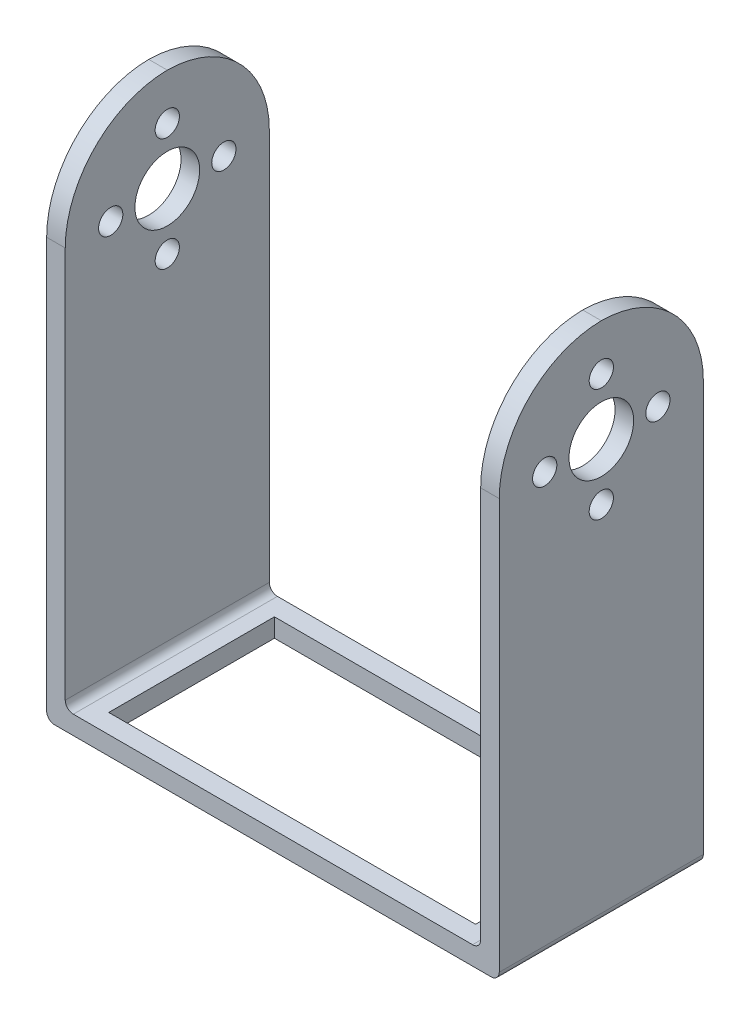
ISO-10303-21;
HEADER;
FILE_DESCRIPTION(('STEP AP214'),'2;1');
FILE_NAME('part.step','',(''),(''),'','','');
FILE_SCHEMA(('AUTOMOTIVE_DESIGN { 1 0 10303 214 1 1 1 1 }'));
ENDSEC;
DATA;
#1=APPLICATION_CONTEXT('core data for automotive mechanical design processes');
#2=APPLICATION_PROTOCOL_DEFINITION('international standard','automotive_design',2000,#1);
#3=PRODUCT_CONTEXT('',#1,'mechanical');
#4=PRODUCT('Part','Part','',(#3));
#5=PRODUCT_RELATED_PRODUCT_CATEGORY('part','',(#4));
#6=PRODUCT_DEFINITION_FORMATION('','',#4);
#7=PRODUCT_DEFINITION_CONTEXT('part definition',#1,'design');
#8=PRODUCT_DEFINITION('design','',#6,#7);
#9=PRODUCT_DEFINITION_SHAPE('','',#8);
#10=(LENGTH_UNIT() NAMED_UNIT(*) SI_UNIT(.MILLI.,.METRE.));
#11=(NAMED_UNIT(*) PLANE_ANGLE_UNIT() SI_UNIT($,.RADIAN.));
#12=(NAMED_UNIT(*) SI_UNIT($,.STERADIAN.) SOLID_ANGLE_UNIT());
#13=UNCERTAINTY_MEASURE_WITH_UNIT(LENGTH_MEASURE(1.E-05),#10,'distance_accuracy_value','');
#14=(GEOMETRIC_REPRESENTATION_CONTEXT(3) GLOBAL_UNCERTAINTY_ASSIGNED_CONTEXT((#13)) GLOBAL_UNIT_ASSIGNED_CONTEXT((#10,
#11,#12)) REPRESENTATION_CONTEXT('',''));
#15=CARTESIAN_POINT('',(0.,0.,0.));
#16=DIRECTION('',(0.,0.,1.));
#17=DIRECTION('',(1.,0.,0.));
#18=AXIS2_PLACEMENT_3D('',#15,#16,#17);
#19=CARTESIAN_POINT('',(28.,32.25,25.25));
#20=DIRECTION('',(-1.,0.,0.));
#21=DIRECTION('',(0.,-1.,0.));
#22=AXIS2_PLACEMENT_3D('',#19,#20,#21);
#23=PLANE('',#22);
#24=CARTESIAN_POINT('',(28.,26.5493872401775,12.625));
#25=DIRECTION('',(-1.,0.,0.));
#26=DIRECTION('',(0.,-1.,0.));
#27=AXIS2_PLACEMENT_3D('',#24,#25,#26);
#28=CIRCLE('',#27,1.5);
#29=CARTESIAN_POINT('',(28.,25.0493872401775,12.625));
#30=VERTEX_POINT('',#29);
#31=EDGE_CURVE('E678',#30,#30,#28,.T.);
#32=ORIENTED_EDGE('',*,*,#31,.T.);
#33=EDGE_LOOP('',(#32));
#34=FACE_BOUND('',#33,.T.);
#35=CARTESIAN_POINT('',(28.,19.5493872401775,19.625));
#36=DIRECTION('',(-1.,0.,0.));
#37=DIRECTION('',(0.,-1.,0.));
#38=AXIS2_PLACEMENT_3D('',#35,#36,#37);
#39=CIRCLE('',#38,1.5);
#40=CARTESIAN_POINT('',(28.,18.0493872401775,19.625));
#41=VERTEX_POINT('',#40);
#42=EDGE_CURVE('E671',#41,#41,#39,.T.);
#43=ORIENTED_EDGE('',*,*,#42,.T.);
#44=EDGE_LOOP('',(#43));
#45=FACE_BOUND('',#44,.T.);
#46=CARTESIAN_POINT('',(28.,12.5493872401775,12.625));
#47=DIRECTION('',(-1.,0.,0.));
#48=DIRECTION('',(0.,-1.,0.));
#49=AXIS2_PLACEMENT_3D('',#46,#47,#48);
#50=CIRCLE('',#49,1.5);
#51=CARTESIAN_POINT('',(28.,11.0493872401775,12.625));
#52=VERTEX_POINT('',#51);
#53=EDGE_CURVE('E692',#52,#52,#50,.T.);
#54=ORIENTED_EDGE('',*,*,#53,.T.);
#55=EDGE_LOOP('',(#54));
#56=FACE_BOUND('',#55,.T.);
#57=CARTESIAN_POINT('',(28.,19.5493872401775,5.625));
#58=DIRECTION('',(-1.,0.,0.));
#59=DIRECTION('',(0.,-1.,0.));
#60=AXIS2_PLACEMENT_3D('',#57,#58,#59);
#61=CIRCLE('',#60,1.5);
#62=CARTESIAN_POINT('',(28.,18.0493872401775,5.625));
#63=VERTEX_POINT('',#62);
#64=EDGE_CURVE('E684',#63,#63,#61,.T.);
#65=ORIENTED_EDGE('',*,*,#64,.T.);
#66=EDGE_LOOP('',(#65));
#67=FACE_BOUND('',#66,.T.);
#68=CARTESIAN_POINT('',(28.,19.5493872401775,12.625));
#69=DIRECTION('',(-1.,0.,0.));
#70=DIRECTION('',(0.,-1.,0.));
#71=AXIS2_PLACEMENT_3D('',#68,#69,#70);
#72=CIRCLE('',#71,4.);
#73=CARTESIAN_POINT('',(28.,15.5493872401775,12.625));
#74=VERTEX_POINT('',#73);
#75=EDGE_CURVE('E367',#74,#74,#72,.T.);
#76=ORIENTED_EDGE('',*,*,#75,.T.);
#77=EDGE_LOOP('',(#76));
#78=FACE_BOUND('',#77,.T.);
#79=CARTESIAN_POINT('',(28.,19.5,12.75));
#80=DIRECTION('',(-1.,0.,0.));
#81=DIRECTION('',(0.,-1.,0.));
#82=AXIS2_PLACEMENT_3D('',#79,#80,#81);
#83=CIRCLE('',#82,12.75);
#84=CARTESIAN_POINT('',(28.,19.5,0.));
#85=VERTEX_POINT('',#84);
#86=CARTESIAN_POINT('',(28.,32.2493872401775,12.625));
#87=VERTEX_POINT('',#86);
#88=EDGE_CURVE('E336',#85,#87,#83,.F.);
#89=ORIENTED_EDGE('',*,*,#88,.T.);
#90=CARTESIAN_POINT('',(28.,19.5,12.5));
#91=DIRECTION('',(-1.,0.,0.));
#92=DIRECTION('',(0.,-1.,0.));
#93=AXIS2_PLACEMENT_3D('',#90,#91,#92);
#94=CIRCLE('',#93,12.75);
#95=CARTESIAN_POINT('',(28.,19.5,25.25));
#96=VERTEX_POINT('',#95);
#97=EDGE_CURVE('E339',#87,#96,#94,.F.);
#98=ORIENTED_EDGE('',*,*,#97,.T.);
#99=DIRECTION('',(0.,1.,0.));
#100=VECTOR('',#99,1.);
#101=CARTESIAN_POINT('',(28.,32.25,25.25));
#102=LINE('',#101,#100);
#103=CARTESIAN_POINT('',(28.,-31.25,25.25));
#104=VERTEX_POINT('',#103);
#105=EDGE_CURVE('E233',#104,#96,#102,.T.);
#106=ORIENTED_EDGE('',*,*,#105,.F.);
#107=DIRECTION('',(0.,0.,-1.));
#108=VECTOR('',#107,1.);
#109=CARTESIAN_POINT('',(28.,-31.25,25.25));
#110=LINE('',#109,#108);
#111=CARTESIAN_POINT('',(28.,-31.25,0.));
#112=VERTEX_POINT('',#111);
#113=EDGE_CURVE('E278',#104,#112,#110,.T.);
#114=ORIENTED_EDGE('',*,*,#113,.T.);
#115=DIRECTION('',(0.,1.,0.));
#116=VECTOR('',#115,1.);
#117=CARTESIAN_POINT('',(28.,32.25,0.));
#118=LINE('',#117,#116);
#119=EDGE_CURVE('E221',#112,#85,#118,.T.);
#120=ORIENTED_EDGE('',*,*,#119,.T.);
#121=EDGE_LOOP('',(#89,#98,#106,#114,#120));
#122=FACE_BOUND('',#121,.T.);
#123=ADVANCED_FACE('F45',(#34,#45,#56,#67,#78,#122),#23,.F.);
#124=CARTESIAN_POINT('',(-28.,32.25,25.25));
#125=DIRECTION('',(1.,0.,0.));
#126=DIRECTION('',(0.,1.,0.));
#127=AXIS2_PLACEMENT_3D('',#124,#125,#126);
#128=PLANE('',#127);
#129=CARTESIAN_POINT('',(-28.,26.5493872401775,12.625));
#130=DIRECTION('',(-1.,0.,0.));
#131=DIRECTION('',(0.,-1.,0.));
#132=AXIS2_PLACEMENT_3D('',#129,#130,#131);
#133=CIRCLE('',#132,1.5);
#134=CARTESIAN_POINT('',(-28.,25.0493872401775,12.625));
#135=VERTEX_POINT('',#134);
#136=EDGE_CURVE('E667',#135,#135,#133,.T.);
#137=ORIENTED_EDGE('',*,*,#136,.F.);
#138=EDGE_LOOP('',(#137));
#139=FACE_BOUND('',#138,.T.);
#140=CARTESIAN_POINT('',(-28.,19.5493872401775,19.625));
#141=DIRECTION('',(-1.,0.,0.));
#142=DIRECTION('',(0.,-1.,0.));
#143=AXIS2_PLACEMENT_3D('',#140,#141,#142);
#144=CIRCLE('',#143,1.5);
#145=CARTESIAN_POINT('',(-28.,18.0493872401775,19.625));
#146=VERTEX_POINT('',#145);
#147=EDGE_CURVE('E652',#146,#146,#144,.T.);
#148=ORIENTED_EDGE('',*,*,#147,.F.);
#149=EDGE_LOOP('',(#148));
#150=FACE_BOUND('',#149,.T.);
#151=CARTESIAN_POINT('',(-28.,12.5493872401775,12.625));
#152=DIRECTION('',(-1.,0.,0.));
#153=DIRECTION('',(0.,-1.,0.));
#154=AXIS2_PLACEMENT_3D('',#151,#152,#153);
#155=CIRCLE('',#154,1.5);
#156=CARTESIAN_POINT('',(-28.,11.0493872401775,12.625));
#157=VERTEX_POINT('',#156);
#158=EDGE_CURVE('E675',#157,#157,#155,.T.);
#159=ORIENTED_EDGE('',*,*,#158,.F.);
#160=EDGE_LOOP('',(#159));
#161=FACE_BOUND('',#160,.T.);
#162=CARTESIAN_POINT('',(-28.,19.5493872401775,5.625));
#163=DIRECTION('',(-1.,0.,0.));
#164=DIRECTION('',(0.,-1.,0.));
#165=AXIS2_PLACEMENT_3D('',#162,#163,#164);
#166=CIRCLE('',#165,1.5);
#167=CARTESIAN_POINT('',(-28.,18.0493872401775,5.625));
#168=VERTEX_POINT('',#167);
#169=EDGE_CURVE('E688',#168,#168,#166,.T.);
#170=ORIENTED_EDGE('',*,*,#169,.F.);
#171=EDGE_LOOP('',(#170));
#172=FACE_BOUND('',#171,.T.);
#173=CARTESIAN_POINT('',(-28.,19.5493872401775,12.625));
#174=DIRECTION('',(-1.,0.,0.));
#175=DIRECTION('',(0.,-1.,0.));
#176=AXIS2_PLACEMENT_3D('',#173,#174,#175);
#177=CIRCLE('',#176,4.);
#178=CARTESIAN_POINT('',(-28.,15.5493872401775,12.625));
#179=VERTEX_POINT('',#178);
#180=EDGE_CURVE('E663',#179,#179,#177,.T.);
#181=ORIENTED_EDGE('',*,*,#180,.F.);
#182=EDGE_LOOP('',(#181));
#183=FACE_BOUND('',#182,.T.);
#184=DIRECTION('',(0.,-1.,0.));
#185=VECTOR('',#184,1.);
#186=CARTESIAN_POINT('',(-28.,32.25,25.25));
#187=LINE('',#186,#185);
#188=CARTESIAN_POINT('',(-28.,19.5,25.25));
#189=VERTEX_POINT('',#188);
#190=CARTESIAN_POINT('',(-28.,-31.25,25.25));
#191=VERTEX_POINT('',#190);
#192=EDGE_CURVE('E237',#189,#191,#187,.T.);
#193=ORIENTED_EDGE('',*,*,#192,.F.);
#194=CARTESIAN_POINT('',(-28.,19.5,12.5));
#195=DIRECTION('',(1.,0.,0.));
#196=DIRECTION('',(0.,1.,0.));
#197=AXIS2_PLACEMENT_3D('',#194,#195,#196);
#198=CIRCLE('',#197,12.75);
#199=CARTESIAN_POINT('',(-28.,32.2493872401775,12.625));
#200=VERTEX_POINT('',#199);
#201=EDGE_CURVE('E321',#189,#200,#198,.F.);
#202=ORIENTED_EDGE('',*,*,#201,.T.);
#203=CARTESIAN_POINT('',(-28.,19.5,12.75));
#204=DIRECTION('',(1.,0.,0.));
#205=DIRECTION('',(0.,1.,0.));
#206=AXIS2_PLACEMENT_3D('',#203,#204,#205);
#207=CIRCLE('',#206,12.75);
#208=CARTESIAN_POINT('',(-28.,19.5,0.));
#209=VERTEX_POINT('',#208);
#210=EDGE_CURVE('E318',#200,#209,#207,.F.);
#211=ORIENTED_EDGE('',*,*,#210,.T.);
#212=DIRECTION('',(0.,-1.,0.));
#213=VECTOR('',#212,1.);
#214=CARTESIAN_POINT('',(-28.,32.25,0.));
#215=LINE('',#214,#213);
#216=CARTESIAN_POINT('',(-28.,-31.25,0.));
#217=VERTEX_POINT('',#216);
#218=EDGE_CURVE('E249',#209,#217,#215,.T.);
#219=ORIENTED_EDGE('',*,*,#218,.T.);
#220=DIRECTION('',(0.,0.,-1.));
#221=VECTOR('',#220,1.);
#222=CARTESIAN_POINT('',(-28.,-31.25,25.25));
#223=LINE('',#222,#221);
#224=EDGE_CURVE('E268',#217,#191,#223,.F.);
#225=ORIENTED_EDGE('',*,*,#224,.T.);
#226=EDGE_LOOP('',(#193,#202,#211,#219,#225));
#227=FACE_BOUND('',#226,.T.);
#228=ADVANCED_FACE('F428',(#139,#150,#161,#172,#183,#227),#128,.F.);
#229=CARTESIAN_POINT('',(-28.,-32.25,25.25));
#230=DIRECTION('',(0.,1.,0.));
#231=DIRECTION('',(0.,0.,1.));
#232=AXIS2_PLACEMENT_3D('',#229,#230,#231);
#233=PLANE('',#232);
#234=DIRECTION('',(-1.,0.,0.));
#235=VECTOR('',#234,1.);
#236=CARTESIAN_POINT('',(-22.6934881901596,-32.25,22.875));
#237=LINE('',#236,#235);
#238=CARTESIAN_POINT('',(22.6934881901596,-32.25,22.875));
#239=VERTEX_POINT('',#238);
#240=CARTESIAN_POINT('',(-22.6934881901596,-32.25,22.875));
#241=VERTEX_POINT('',#240);
#242=EDGE_CURVE('E186',#239,#241,#237,.T.);
#243=ORIENTED_EDGE('',*,*,#242,.F.);
#244=DIRECTION('',(0.,0.,1.));
#245=VECTOR('',#244,1.);
#246=CARTESIAN_POINT('',(22.6934881901596,-32.25,22.875));
#247=LINE('',#246,#245);
#248=CARTESIAN_POINT('',(22.6934881901596,-32.25,2.375));
#249=VERTEX_POINT('',#248);
#250=EDGE_CURVE('E63',#249,#239,#247,.T.);
#251=ORIENTED_EDGE('',*,*,#250,.F.);
#252=DIRECTION('',(1.,0.,0.));
#253=VECTOR('',#252,1.);
#254=CARTESIAN_POINT('',(-22.6934881901596,-32.25,2.375));
#255=LINE('',#254,#253);
#256=CARTESIAN_POINT('',(-22.6934881901596,-32.25,2.375));
#257=VERTEX_POINT('',#256);
#258=EDGE_CURVE('E194',#257,#249,#255,.T.);
#259=ORIENTED_EDGE('',*,*,#258,.F.);
#260=DIRECTION('',(0.,0.,-1.));
#261=VECTOR('',#260,1.);
#262=CARTESIAN_POINT('',(-22.6934881901596,-32.25,22.875));
#263=LINE('',#262,#261);
#264=EDGE_CURVE('E176',#241,#257,#263,.T.);
#265=ORIENTED_EDGE('',*,*,#264,.F.);
#266=EDGE_LOOP('',(#243,#251,#259,#265));
#267=FACE_BOUND('',#266,.T.);
#268=DIRECTION('',(1.,0.,0.));
#269=VECTOR('',#268,1.);
#270=CARTESIAN_POINT('',(-28.,-32.25,25.25));
#271=LINE('',#270,#269);
#272=CARTESIAN_POINT('',(-27.,-32.25,25.25));
#273=VERTEX_POINT('',#272);
#274=CARTESIAN_POINT('',(27.,-32.25,25.25));
#275=VERTEX_POINT('',#274);
#276=EDGE_CURVE('E241',#273,#275,#271,.T.);
#277=ORIENTED_EDGE('',*,*,#276,.F.);
#278=DIRECTION('',(0.,0.,-1.));
#279=VECTOR('',#278,1.);
#280=CARTESIAN_POINT('',(-27.,-32.25,25.25));
#281=LINE('',#280,#279);
#282=CARTESIAN_POINT('',(-27.,-32.25,0.));
#283=VERTEX_POINT('',#282);
#284=EDGE_CURVE('E257',#273,#283,#281,.T.);
#285=ORIENTED_EDGE('',*,*,#284,.T.);
#286=DIRECTION('',(1.,0.,0.));
#287=VECTOR('',#286,1.);
#288=CARTESIAN_POINT('',(-28.,-32.25,0.));
#289=LINE('',#288,#287);
#290=CARTESIAN_POINT('',(27.,-32.25,0.));
#291=VERTEX_POINT('',#290);
#292=EDGE_CURVE('E238',#283,#291,#289,.T.);
#293=ORIENTED_EDGE('',*,*,#292,.T.);
#294=DIRECTION('',(0.,0.,-1.));
#295=VECTOR('',#294,1.);
#296=CARTESIAN_POINT('',(27.,-32.25,25.25));
#297=LINE('',#296,#295);
#298=EDGE_CURVE('E245',#291,#275,#297,.F.);
#299=ORIENTED_EDGE('',*,*,#298,.T.);
#300=EDGE_LOOP('',(#277,#285,#293,#299));
#301=FACE_BOUND('',#300,.T.);
#302=ADVANCED_FACE('F191',(#267,#301),#233,.F.);
#303=CARTESIAN_POINT('',(0.,0.,25.25));
#304=DIRECTION('',(0.,0.,1.));
#305=DIRECTION('',(1.,0.,0.));
#306=AXIS2_PLACEMENT_3D('',#303,#304,#305);
#307=PLANE('',#306);
#308=DIRECTION('',(0.,-1.,0.));
#309=VECTOR('',#308,1.);
#310=CARTESIAN_POINT('',(-25.7,32.25,25.25));
#311=LINE('',#310,#309);
#312=CARTESIAN_POINT('',(-25.7,19.5,25.25));
#313=VERTEX_POINT('',#312);
#314=CARTESIAN_POINT('',(-25.7,-28.95,25.25));
#315=VERTEX_POINT('',#314);
#316=EDGE_CURVE('E222',#313,#315,#311,.T.);
#317=ORIENTED_EDGE('',*,*,#316,.F.);
#318=DIRECTION('',(-1.,0.,0.));
#319=VECTOR('',#318,1.);
#320=CARTESIAN_POINT('',(-28.,19.5,25.25));
#321=LINE('',#320,#319);
#322=EDGE_CURVE('E314',#313,#189,#321,.T.);
#323=ORIENTED_EDGE('',*,*,#322,.T.);
#324=ORIENTED_EDGE('',*,*,#192,.T.);
#325=CARTESIAN_POINT('',(-27.,-31.25,25.25));
#326=DIRECTION('',(0.,0.,1.));
#327=DIRECTION('',(1.,0.,0.));
#328=AXIS2_PLACEMENT_3D('',#325,#326,#327);
#329=CIRCLE('',#328,1.);
#330=EDGE_CURVE('E275',#191,#273,#329,.T.);
#331=ORIENTED_EDGE('',*,*,#330,.T.);
#332=ORIENTED_EDGE('',*,*,#276,.T.);
#333=CARTESIAN_POINT('',(27.,-31.25,25.25));
#334=DIRECTION('',(0.,0.,1.));
#335=DIRECTION('',(1.,0.,0.));
#336=AXIS2_PLACEMENT_3D('',#333,#334,#335);
#337=CIRCLE('',#336,1.);
#338=EDGE_CURVE('E272',#275,#104,#337,.T.);
#339=ORIENTED_EDGE('',*,*,#338,.T.);
#340=ORIENTED_EDGE('',*,*,#105,.T.);
#341=DIRECTION('',(-1.,0.,0.));
#342=VECTOR('',#341,1.);
#343=CARTESIAN_POINT('',(25.7,19.5,25.25));
#344=LINE('',#343,#342);
#345=CARTESIAN_POINT('',(25.7,19.5,25.25));
#346=VERTEX_POINT('',#345);
#347=EDGE_CURVE('E310',#96,#346,#344,.T.);
#348=ORIENTED_EDGE('',*,*,#347,.T.);
#349=DIRECTION('',(0.,1.,0.));
#350=VECTOR('',#349,1.);
#351=CARTESIAN_POINT('',(25.7,32.25,25.25));
#352=LINE('',#351,#350);
#353=CARTESIAN_POINT('',(25.7,-28.95,25.25));
#354=VERTEX_POINT('',#353);
#355=EDGE_CURVE('E213',#354,#346,#352,.T.);
#356=ORIENTED_EDGE('',*,*,#355,.F.);
#357=CARTESIAN_POINT('',(24.7,-28.95,25.25));
#358=DIRECTION('',(0.,0.,1.));
#359=DIRECTION('',(1.,0.,0.));
#360=AXIS2_PLACEMENT_3D('',#357,#358,#359);
#361=CIRCLE('',#360,1.);
#362=CARTESIAN_POINT('',(24.7,-29.95,25.25));
#363=VERTEX_POINT('',#362);
#364=EDGE_CURVE('E297',#354,#363,#361,.F.);
#365=ORIENTED_EDGE('',*,*,#364,.T.);
#366=DIRECTION('',(1.,0.,0.));
#367=VECTOR('',#366,1.);
#368=CARTESIAN_POINT('',(-25.7,-29.95,25.25));
#369=LINE('',#368,#367);
#370=CARTESIAN_POINT('',(-24.7,-29.95,25.25));
#371=VERTEX_POINT('',#370);
#372=EDGE_CURVE('E225',#371,#363,#369,.T.);
#373=ORIENTED_EDGE('',*,*,#372,.F.);
#374=CARTESIAN_POINT('',(-24.7,-28.95,25.25));
#375=DIRECTION('',(0.,0.,1.));
#376=DIRECTION('',(1.,0.,0.));
#377=AXIS2_PLACEMENT_3D('',#374,#375,#376);
#378=CIRCLE('',#377,1.);
#379=EDGE_CURVE('E303',#371,#315,#378,.F.);
#380=ORIENTED_EDGE('',*,*,#379,.T.);
#381=EDGE_LOOP('',(#317,#323,#324,#331,#332,#339,#340,#348,#356,#365,#373,#380));
#382=FACE_BOUND('',#381,.T.);
#383=ADVANCED_FACE('F486',(#382),#307,.T.);
#384=CARTESIAN_POINT('',(0.,0.,0.));
#385=DIRECTION('',(0.,0.,1.));
#386=DIRECTION('',(1.,0.,0.));
#387=AXIS2_PLACEMENT_3D('',#384,#385,#386);
#388=PLANE('',#387);
#389=ORIENTED_EDGE('',*,*,#218,.F.);
#390=DIRECTION('',(-1.,0.,0.));
#391=VECTOR('',#390,1.);
#392=CARTESIAN_POINT('',(0.,19.5,0.));
#393=LINE('',#392,#391);
#394=CARTESIAN_POINT('',(-25.7,19.5,0.));
#395=VERTEX_POINT('',#394);
#396=EDGE_CURVE('E345',#209,#395,#393,.F.);
#397=ORIENTED_EDGE('',*,*,#396,.T.);
#398=DIRECTION('',(0.,-1.,0.));
#399=VECTOR('',#398,1.);
#400=CARTESIAN_POINT('',(-25.7,32.25,0.));
#401=LINE('',#400,#399);
#402=CARTESIAN_POINT('',(-25.7,-28.95,0.));
#403=VERTEX_POINT('',#402);
#404=EDGE_CURVE('E209',#395,#403,#401,.T.);
#405=ORIENTED_EDGE('',*,*,#404,.T.);
#406=CARTESIAN_POINT('',(-24.7,-28.95,0.));
#407=DIRECTION('',(0.,0.,1.));
#408=DIRECTION('',(1.,0.,0.));
#409=AXIS2_PLACEMENT_3D('',#406,#407,#408);
#410=CIRCLE('',#409,1.);
#411=CARTESIAN_POINT('',(-24.7,-29.95,0.));
#412=VERTEX_POINT('',#411);
#413=EDGE_CURVE('E307',#403,#412,#410,.T.);
#414=ORIENTED_EDGE('',*,*,#413,.T.);
#415=DIRECTION('',(1.,0.,0.));
#416=VECTOR('',#415,1.);
#417=CARTESIAN_POINT('',(-25.7,-29.95,0.));
#418=LINE('',#417,#416);
#419=CARTESIAN_POINT('',(24.7,-29.95,0.));
#420=VERTEX_POINT('',#419);
#421=EDGE_CURVE('E212',#412,#420,#418,.T.);
#422=ORIENTED_EDGE('',*,*,#421,.T.);
#423=CARTESIAN_POINT('',(24.7,-28.95,0.));
#424=DIRECTION('',(0.,0.,1.));
#425=DIRECTION('',(1.,0.,0.));
#426=AXIS2_PLACEMENT_3D('',#423,#424,#425);
#427=CIRCLE('',#426,1.);
#428=CARTESIAN_POINT('',(25.7,-28.95,0.));
#429=VERTEX_POINT('',#428);
#430=EDGE_CURVE('E300',#420,#429,#427,.T.);
#431=ORIENTED_EDGE('',*,*,#430,.T.);
#432=DIRECTION('',(0.,1.,0.));
#433=VECTOR('',#432,1.);
#434=CARTESIAN_POINT('',(25.7,32.25,0.));
#435=LINE('',#434,#433);
#436=CARTESIAN_POINT('',(25.7,19.5,0.));
#437=VERTEX_POINT('',#436);
#438=EDGE_CURVE('E217',#429,#437,#435,.T.);
#439=ORIENTED_EDGE('',*,*,#438,.T.);
#440=DIRECTION('',(-1.,0.,0.));
#441=VECTOR('',#440,1.);
#442=CARTESIAN_POINT('',(0.,19.5,0.));
#443=LINE('',#442,#441);
#444=EDGE_CURVE('E342',#437,#85,#443,.F.);
#445=ORIENTED_EDGE('',*,*,#444,.T.);
#446=ORIENTED_EDGE('',*,*,#119,.F.);
#447=CARTESIAN_POINT('',(27.,-31.25,0.));
#448=DIRECTION('',(0.,0.,1.));
#449=DIRECTION('',(1.,0.,0.));
#450=AXIS2_PLACEMENT_3D('',#447,#448,#449);
#451=CIRCLE('',#450,1.);
#452=EDGE_CURVE('E261',#112,#291,#451,.F.);
#453=ORIENTED_EDGE('',*,*,#452,.T.);
#454=ORIENTED_EDGE('',*,*,#292,.F.);
#455=CARTESIAN_POINT('',(-27.,-31.25,0.));
#456=DIRECTION('',(0.,0.,1.));
#457=DIRECTION('',(1.,0.,0.));
#458=AXIS2_PLACEMENT_3D('',#455,#456,#457);
#459=CIRCLE('',#458,1.);
#460=EDGE_CURVE('E264',#283,#217,#459,.F.);
#461=ORIENTED_EDGE('',*,*,#460,.T.);
#462=EDGE_LOOP('',(#389,#397,#405,#414,#422,#431,#439,#445,#446,#453,#454,#461));
#463=FACE_BOUND('',#462,.T.);
#464=ADVANCED_FACE('F494',(#463),#388,.F.);
#465=CARTESIAN_POINT('',(-25.7,32.25,0.));
#466=DIRECTION('',(-1.,0.,0.));
#467=DIRECTION('',(0.,-1.,0.));
#468=AXIS2_PLACEMENT_3D('',#465,#466,#467);
#469=PLANE('',#468);
#470=CARTESIAN_POINT('',(-25.7,26.5493872401775,12.625));
#471=DIRECTION('',(-1.,0.,0.));
#472=DIRECTION('',(0.,-1.,0.));
#473=AXIS2_PLACEMENT_3D('',#470,#471,#472);
#474=CIRCLE('',#473,1.5);
#475=CARTESIAN_POINT('',(-25.7,25.0493872401775,12.625));
#476=VERTEX_POINT('',#475);
#477=EDGE_CURVE('E394',#476,#476,#474,.T.);
#478=ORIENTED_EDGE('',*,*,#477,.T.);
#479=EDGE_LOOP('',(#478));
#480=FACE_BOUND('',#479,.T.);
#481=CARTESIAN_POINT('',(-25.7,19.5493872401775,19.625));
#482=DIRECTION('',(-1.,0.,0.));
#483=DIRECTION('',(0.,-1.,0.));
#484=AXIS2_PLACEMENT_3D('',#481,#482,#483);
#485=CIRCLE('',#484,1.5);
#486=CARTESIAN_POINT('',(-25.7,18.0493872401775,19.625));
#487=VERTEX_POINT('',#486);
#488=EDGE_CURVE('E380',#487,#487,#485,.T.);
#489=ORIENTED_EDGE('',*,*,#488,.T.);
#490=EDGE_LOOP('',(#489));
#491=FACE_BOUND('',#490,.T.);
#492=CARTESIAN_POINT('',(-25.7,12.5493872401775,12.625));
#493=DIRECTION('',(-1.,0.,0.));
#494=DIRECTION('',(0.,-1.,0.));
#495=AXIS2_PLACEMENT_3D('',#492,#493,#494);
#496=CIRCLE('',#495,1.5);
#497=CARTESIAN_POINT('',(-25.7,11.0493872401775,12.625));
#498=VERTEX_POINT('',#497);
#499=EDGE_CURVE('E376',#498,#498,#496,.T.);
#500=ORIENTED_EDGE('',*,*,#499,.T.);
#501=EDGE_LOOP('',(#500));
#502=FACE_BOUND('',#501,.T.);
#503=CARTESIAN_POINT('',(-25.7,19.5493872401775,5.625));
#504=DIRECTION('',(-1.,0.,0.));
#505=DIRECTION('',(0.,-1.,0.));
#506=AXIS2_PLACEMENT_3D('',#503,#504,#505);
#507=CIRCLE('',#506,1.5);
#508=CARTESIAN_POINT('',(-25.7,18.0493872401775,5.625));
#509=VERTEX_POINT('',#508);
#510=EDGE_CURVE('E372',#509,#509,#507,.T.);
#511=ORIENTED_EDGE('',*,*,#510,.T.);
#512=EDGE_LOOP('',(#511));
#513=FACE_BOUND('',#512,.T.);
#514=CARTESIAN_POINT('',(-25.7,19.5493872401775,12.625));
#515=DIRECTION('',(-1.,0.,0.));
#516=DIRECTION('',(0.,-1.,0.));
#517=AXIS2_PLACEMENT_3D('',#514,#515,#516);
#518=CIRCLE('',#517,4.);
#519=CARTESIAN_POINT('',(-25.7,15.5493872401775,12.625));
#520=VERTEX_POINT('',#519);
#521=EDGE_CURVE('E366',#520,#520,#518,.T.);
#522=ORIENTED_EDGE('',*,*,#521,.T.);
#523=EDGE_LOOP('',(#522));
#524=FACE_BOUND('',#523,.T.);
#525=CARTESIAN_POINT('',(-25.7,19.5,12.75));
#526=DIRECTION('',(-1.,0.,0.));
#527=DIRECTION('',(0.,-1.,0.));
#528=AXIS2_PLACEMENT_3D('',#525,#526,#527);
#529=CIRCLE('',#528,12.75);
#530=CARTESIAN_POINT('',(-25.7,32.2493872401775,12.625));
#531=VERTEX_POINT('',#530);
#532=EDGE_CURVE('E324',#395,#531,#529,.F.);
#533=ORIENTED_EDGE('',*,*,#532,.T.);
#534=CARTESIAN_POINT('',(-25.7,19.5,12.5));
#535=DIRECTION('',(-1.,0.,0.));
#536=DIRECTION('',(0.,-1.,0.));
#537=AXIS2_PLACEMENT_3D('',#534,#535,#536);
#538=CIRCLE('',#537,12.75);
#539=EDGE_CURVE('E327',#531,#313,#538,.F.);
#540=ORIENTED_EDGE('',*,*,#539,.T.);
#541=ORIENTED_EDGE('',*,*,#316,.T.);
#542=DIRECTION('',(0.,0.,1.));
#543=VECTOR('',#542,1.);
#544=CARTESIAN_POINT('',(-25.7,-28.95,0.));
#545=LINE('',#544,#543);
#546=EDGE_CURVE('E293',#315,#403,#545,.F.);
#547=ORIENTED_EDGE('',*,*,#546,.T.);
#548=ORIENTED_EDGE('',*,*,#404,.F.);
#549=EDGE_LOOP('',(#533,#540,#541,#547,#548));
#550=FACE_BOUND('',#549,.T.);
#551=ADVANCED_FACE('F519',(#480,#491,#502,#513,#524,#550),#469,.F.);
#552=CARTESIAN_POINT('',(25.7,32.25,0.));
#553=DIRECTION('',(1.,0.,0.));
#554=DIRECTION('',(0.,1.,0.));
#555=AXIS2_PLACEMENT_3D('',#552,#553,#554);
#556=PLANE('',#555);
#557=CARTESIAN_POINT('',(25.7,26.5493872401775,12.625));
#558=DIRECTION('',(1.,0.,0.));
#559=DIRECTION('',(0.,1.,0.));
#560=AXIS2_PLACEMENT_3D('',#557,#558,#559);
#561=CIRCLE('',#560,1.5);
#562=CARTESIAN_POINT('',(25.7,28.0493872401775,12.625));
#563=VERTEX_POINT('',#562);
#564=EDGE_CURVE('E49',#563,#563,#561,.T.);
#565=ORIENTED_EDGE('',*,*,#564,.T.);
#566=EDGE_LOOP('',(#565));
#567=FACE_BOUND('',#566,.T.);
#568=CARTESIAN_POINT('',(25.7,19.5493872401775,19.625));
#569=DIRECTION('',(1.,0.,0.));
#570=DIRECTION('',(0.,1.,0.));
#571=AXIS2_PLACEMENT_3D('',#568,#569,#570);
#572=CIRCLE('',#571,1.5);
#573=CARTESIAN_POINT('',(25.7,21.0493872401775,19.625));
#574=VERTEX_POINT('',#573);
#575=EDGE_CURVE('E377',#574,#574,#572,.T.);
#576=ORIENTED_EDGE('',*,*,#575,.T.);
#577=EDGE_LOOP('',(#576));
#578=FACE_BOUND('',#577,.T.);
#579=CARTESIAN_POINT('',(25.7,12.5493872401775,12.625));
#580=DIRECTION('',(1.,0.,0.));
#581=DIRECTION('',(0.,1.,0.));
#582=AXIS2_PLACEMENT_3D('',#579,#580,#581);
#583=CIRCLE('',#582,1.5);
#584=CARTESIAN_POINT('',(25.7,14.0493872401775,12.625));
#585=VERTEX_POINT('',#584);
#586=EDGE_CURVE('E373',#585,#585,#583,.T.);
#587=ORIENTED_EDGE('',*,*,#586,.T.);
#588=EDGE_LOOP('',(#587));
#589=FACE_BOUND('',#588,.T.);
#590=CARTESIAN_POINT('',(25.7,19.5493872401775,5.625));
#591=DIRECTION('',(1.,0.,0.));
#592=DIRECTION('',(0.,1.,0.));
#593=AXIS2_PLACEMENT_3D('',#590,#591,#592);
#594=CIRCLE('',#593,1.5);
#595=CARTESIAN_POINT('',(25.7,21.0493872401775,5.625));
#596=VERTEX_POINT('',#595);
#597=EDGE_CURVE('E368',#596,#596,#594,.T.);
#598=ORIENTED_EDGE('',*,*,#597,.T.);
#599=EDGE_LOOP('',(#598));
#600=FACE_BOUND('',#599,.T.);
#601=CARTESIAN_POINT('',(25.7,19.5493872401775,12.625));
#602=DIRECTION('',(1.,0.,0.));
#603=DIRECTION('',(0.,1.,0.));
#604=AXIS2_PLACEMENT_3D('',#601,#602,#603);
#605=CIRCLE('',#604,4.);
#606=CARTESIAN_POINT('',(25.7,23.5493872401775,12.625));
#607=VERTEX_POINT('',#606);
#608=EDGE_CURVE('E362',#607,#607,#605,.T.);
#609=ORIENTED_EDGE('',*,*,#608,.T.);
#610=EDGE_LOOP('',(#609));
#611=FACE_BOUND('',#610,.T.);
#612=ORIENTED_EDGE('',*,*,#355,.T.);
#613=CARTESIAN_POINT('',(25.7,19.5,12.5));
#614=DIRECTION('',(1.,0.,0.));
#615=DIRECTION('',(0.,1.,0.));
#616=AXIS2_PLACEMENT_3D('',#613,#614,#615);
#617=CIRCLE('',#616,12.75);
#618=CARTESIAN_POINT('',(25.7,32.2493872401775,12.625));
#619=VERTEX_POINT('',#618);
#620=EDGE_CURVE('E333',#346,#619,#617,.F.);
#621=ORIENTED_EDGE('',*,*,#620,.T.);
#622=CARTESIAN_POINT('',(25.7,19.5,12.75));
#623=DIRECTION('',(1.,0.,0.));
#624=DIRECTION('',(0.,1.,0.));
#625=AXIS2_PLACEMENT_3D('',#622,#623,#624);
#626=CIRCLE('',#625,12.75);
#627=EDGE_CURVE('E330',#619,#437,#626,.F.);
#628=ORIENTED_EDGE('',*,*,#627,.T.);
#629=ORIENTED_EDGE('',*,*,#438,.F.);
#630=DIRECTION('',(0.,0.,1.));
#631=VECTOR('',#630,1.);
#632=CARTESIAN_POINT('',(25.7,-28.95,25.25));
#633=LINE('',#632,#631);
#634=EDGE_CURVE('E282',#429,#354,#633,.T.);
#635=ORIENTED_EDGE('',*,*,#634,.T.);
#636=EDGE_LOOP('',(#612,#621,#628,#629,#635));
#637=FACE_BOUND('',#636,.T.);
#638=ADVANCED_FACE('F402',(#567,#578,#589,#600,#611,#637),#556,.F.);
#639=CARTESIAN_POINT('',(-25.7,-29.95,0.));
#640=DIRECTION('',(0.,-1.,0.));
#641=DIRECTION('',(0.,0.,-1.));
#642=AXIS2_PLACEMENT_3D('',#639,#640,#641);
#643=PLANE('',#642);
#644=DIRECTION('',(1.,0.,0.));
#645=VECTOR('',#644,1.);
#646=CARTESIAN_POINT('',(-25.7,-29.95,2.375));
#647=LINE('',#646,#645);
#648=CARTESIAN_POINT('',(-22.6934881901596,-29.95,2.375));
#649=VERTEX_POINT('',#648);
#650=CARTESIAN_POINT('',(22.6934881901596,-29.95,2.375));
#651=VERTEX_POINT('',#650);
#652=EDGE_CURVE('E55',#649,#651,#647,.T.);
#653=ORIENTED_EDGE('',*,*,#652,.T.);
#654=DIRECTION('',(0.,0.,1.));
#655=VECTOR('',#654,1.);
#656=CARTESIAN_POINT('',(22.6934881901596,-29.95,0.));
#657=LINE('',#656,#655);
#658=CARTESIAN_POINT('',(22.6934881901596,-29.95,22.875));
#659=VERTEX_POINT('',#658);
#660=EDGE_CURVE('E11',#651,#659,#657,.T.);
#661=ORIENTED_EDGE('',*,*,#660,.T.);
#662=DIRECTION('',(-1.,0.,0.));
#663=VECTOR('',#662,1.);
#664=CARTESIAN_POINT('',(-25.7,-29.95,22.875));
#665=LINE('',#664,#663);
#666=CARTESIAN_POINT('',(-22.6934881901596,-29.95,22.875));
#667=VERTEX_POINT('',#666);
#668=EDGE_CURVE('E348',#659,#667,#665,.T.);
#669=ORIENTED_EDGE('',*,*,#668,.T.);
#670=DIRECTION('',(0.,0.,-1.));
#671=VECTOR('',#670,1.);
#672=CARTESIAN_POINT('',(-22.6934881901596,-29.95,0.));
#673=LINE('',#672,#671);
#674=EDGE_CURVE('E179',#667,#649,#673,.T.);
#675=ORIENTED_EDGE('',*,*,#674,.T.);
#676=EDGE_LOOP('',(#653,#661,#669,#675));
#677=FACE_BOUND('',#676,.T.);
#678=ORIENTED_EDGE('',*,*,#372,.T.);
#679=DIRECTION('',(0.,0.,1.));
#680=VECTOR('',#679,1.);
#681=CARTESIAN_POINT('',(24.7,-29.95,0.));
#682=LINE('',#681,#680);
#683=EDGE_CURVE('E290',#363,#420,#682,.F.);
#684=ORIENTED_EDGE('',*,*,#683,.T.);
#685=ORIENTED_EDGE('',*,*,#421,.F.);
#686=DIRECTION('',(0.,0.,1.));
#687=VECTOR('',#686,1.);
#688=CARTESIAN_POINT('',(-24.7,-29.95,25.25));
#689=LINE('',#688,#687);
#690=EDGE_CURVE('E286',#412,#371,#689,.T.);
#691=ORIENTED_EDGE('',*,*,#690,.T.);
#692=EDGE_LOOP('',(#678,#684,#685,#691));
#693=FACE_BOUND('',#692,.T.);
#694=ADVANCED_FACE('F445',(#677,#693),#643,.F.);
#695=CARTESIAN_POINT('',(-27.,-31.25,25.25));
#696=DIRECTION('',(0.,0.,-1.));
#697=DIRECTION('',(-1.,0.,0.));
#698=AXIS2_PLACEMENT_3D('',#695,#696,#697);
#699=CYLINDRICAL_SURFACE('',#698,1.);
#700=ORIENTED_EDGE('',*,*,#330,.F.);
#701=ORIENTED_EDGE('',*,*,#224,.F.);
#702=ORIENTED_EDGE('',*,*,#460,.F.);
#703=ORIENTED_EDGE('',*,*,#284,.F.);
#704=EDGE_LOOP('',(#700,#701,#702,#703));
#705=FACE_BOUND('',#704,.T.);
#706=ADVANCED_FACE('F441',(#705),#699,.T.);
#707=CARTESIAN_POINT('',(27.,-31.25,25.25));
#708=DIRECTION('',(0.,0.,-1.));
#709=DIRECTION('',(-1.,0.,0.));
#710=AXIS2_PLACEMENT_3D('',#707,#708,#709);
#711=CYLINDRICAL_SURFACE('',#710,1.);
#712=ORIENTED_EDGE('',*,*,#338,.F.);
#713=ORIENTED_EDGE('',*,*,#298,.F.);
#714=ORIENTED_EDGE('',*,*,#452,.F.);
#715=ORIENTED_EDGE('',*,*,#113,.F.);
#716=EDGE_LOOP('',(#712,#713,#714,#715));
#717=FACE_BOUND('',#716,.T.);
#718=ADVANCED_FACE('F444',(#717),#711,.T.);
#719=CARTESIAN_POINT('',(24.7,-28.95,0.));
#720=DIRECTION('',(0.,0.,-1.));
#721=DIRECTION('',(-1.,0.,0.));
#722=AXIS2_PLACEMENT_3D('',#719,#720,#721);
#723=CYLINDRICAL_SURFACE('',#722,1.);
#724=ORIENTED_EDGE('',*,*,#430,.F.);
#725=ORIENTED_EDGE('',*,*,#683,.F.);
#726=ORIENTED_EDGE('',*,*,#364,.F.);
#727=ORIENTED_EDGE('',*,*,#634,.F.);
#728=EDGE_LOOP('',(#724,#725,#726,#727));
#729=FACE_BOUND('',#728,.T.);
#730=ADVANCED_FACE('F449',(#729),#723,.F.);
#731=CARTESIAN_POINT('',(-24.7,-28.95,0.));
#732=DIRECTION('',(0.,0.,-1.));
#733=DIRECTION('',(-1.,0.,0.));
#734=AXIS2_PLACEMENT_3D('',#731,#732,#733);
#735=CYLINDRICAL_SURFACE('',#734,1.);
#736=ORIENTED_EDGE('',*,*,#413,.F.);
#737=ORIENTED_EDGE('',*,*,#546,.F.);
#738=ORIENTED_EDGE('',*,*,#379,.F.);
#739=ORIENTED_EDGE('',*,*,#690,.F.);
#740=EDGE_LOOP('',(#736,#737,#738,#739));
#741=FACE_BOUND('',#740,.T.);
#742=ADVANCED_FACE('F453',(#741),#735,.F.);
#743=CARTESIAN_POINT('',(-28.,19.5,12.75));
#744=DIRECTION('',(-1.,0.,0.));
#745=DIRECTION('',(0.,0.,1.));
#746=AXIS2_PLACEMENT_3D('',#743,#744,#745);
#747=CYLINDRICAL_SURFACE('',#746,12.75);
#748=DIRECTION('',(-1.,0.,0.));
#749=VECTOR('',#748,1.);
#750=CARTESIAN_POINT('',(-26.85,32.2493872401775,12.625));
#751=LINE('',#750,#749);
#752=EDGE_CURVE('E226',#531,#200,#751,.T.);
#753=ORIENTED_EDGE('',*,*,#752,.F.);
#754=ORIENTED_EDGE('',*,*,#532,.F.);
#755=ORIENTED_EDGE('',*,*,#396,.F.);
#756=ORIENTED_EDGE('',*,*,#210,.F.);
#757=EDGE_LOOP('',(#753,#754,#755,#756));
#758=FACE_BOUND('',#757,.T.);
#759=ADVANCED_FACE('F457',(#758),#747,.T.);
#760=CARTESIAN_POINT('',(0.,19.5,12.5));
#761=DIRECTION('',(1.,0.,0.));
#762=DIRECTION('',(0.,0.,-1.));
#763=AXIS2_PLACEMENT_3D('',#760,#761,#762);
#764=CYLINDRICAL_SURFACE('',#763,12.75);
#765=ORIENTED_EDGE('',*,*,#539,.F.);
#766=ORIENTED_EDGE('',*,*,#752,.T.);
#767=ORIENTED_EDGE('',*,*,#201,.F.);
#768=ORIENTED_EDGE('',*,*,#322,.F.);
#769=EDGE_LOOP('',(#765,#766,#767,#768));
#770=FACE_BOUND('',#769,.T.);
#771=ADVANCED_FACE('F459',(#770),#764,.T.);
#772=CARTESIAN_POINT('',(-28.,19.5,12.75));
#773=DIRECTION('',(-1.,0.,0.));
#774=DIRECTION('',(0.,0.,1.));
#775=AXIS2_PLACEMENT_3D('',#772,#773,#774);
#776=CYLINDRICAL_SURFACE('',#775,12.75);
#777=DIRECTION('',(-1.,0.,0.));
#778=VECTOR('',#777,1.);
#779=CARTESIAN_POINT('',(26.85,32.2493872401775,12.625));
#780=LINE('',#779,#778);
#781=EDGE_CURVE('E204',#87,#619,#780,.T.);
#782=ORIENTED_EDGE('',*,*,#781,.F.);
#783=ORIENTED_EDGE('',*,*,#88,.F.);
#784=ORIENTED_EDGE('',*,*,#444,.F.);
#785=ORIENTED_EDGE('',*,*,#627,.F.);
#786=EDGE_LOOP('',(#782,#783,#784,#785));
#787=FACE_BOUND('',#786,.T.);
#788=ADVANCED_FACE('F47',(#787),#776,.T.);
#789=CARTESIAN_POINT('',(0.,19.5,12.5));
#790=DIRECTION('',(1.,0.,0.));
#791=DIRECTION('',(0.,0.,-1.));
#792=AXIS2_PLACEMENT_3D('',#789,#790,#791);
#793=CYLINDRICAL_SURFACE('',#792,12.75);
#794=ORIENTED_EDGE('',*,*,#97,.F.);
#795=ORIENTED_EDGE('',*,*,#781,.T.);
#796=ORIENTED_EDGE('',*,*,#620,.F.);
#797=ORIENTED_EDGE('',*,*,#347,.F.);
#798=EDGE_LOOP('',(#794,#795,#796,#797));
#799=FACE_BOUND('',#798,.T.);
#800=ADVANCED_FACE('F465',(#799),#793,.T.);
#801=CARTESIAN_POINT('',(22.6934881901596,32.2493872401775,22.875));
#802=DIRECTION('',(1.,0.,0.));
#803=DIRECTION('',(0.,0.,-1.));
#804=AXIS2_PLACEMENT_3D('',#801,#802,#803);
#805=PLANE('',#804);
#806=DIRECTION('',(0.,-1.,0.));
#807=VECTOR('',#806,1.);
#808=CARTESIAN_POINT('',(22.6934881901596,32.2493872401775,2.375));
#809=LINE('',#808,#807);
#810=EDGE_CURVE('E201',#651,#249,#809,.T.);
#811=ORIENTED_EDGE('',*,*,#810,.T.);
#812=ORIENTED_EDGE('',*,*,#250,.T.);
#813=DIRECTION('',(0.,-1.,0.));
#814=VECTOR('',#813,1.);
#815=CARTESIAN_POINT('',(22.6934881901596,32.2493872401775,22.875));
#816=LINE('',#815,#814);
#817=EDGE_CURVE('E183',#659,#239,#816,.T.);
#818=ORIENTED_EDGE('',*,*,#817,.F.);
#819=ORIENTED_EDGE('',*,*,#660,.F.);
#820=EDGE_LOOP('',(#811,#812,#818,#819));
#821=FACE_BOUND('',#820,.T.);
#822=ADVANCED_FACE('F467',(#821),#805,.F.);
#823=CARTESIAN_POINT('',(-22.6934881901596,32.2493872401775,2.375));
#824=DIRECTION('',(0.,0.,-1.));
#825=DIRECTION('',(-1.,0.,0.));
#826=AXIS2_PLACEMENT_3D('',#823,#824,#825);
#827=PLANE('',#826);
#828=DIRECTION('',(0.,-1.,0.));
#829=VECTOR('',#828,1.);
#830=CARTESIAN_POINT('',(-22.6934881901596,32.2493872401775,2.375));
#831=LINE('',#830,#829);
#832=EDGE_CURVE('E182',#649,#257,#831,.T.);
#833=ORIENTED_EDGE('',*,*,#832,.T.);
#834=ORIENTED_EDGE('',*,*,#258,.T.);
#835=ORIENTED_EDGE('',*,*,#810,.F.);
#836=ORIENTED_EDGE('',*,*,#652,.F.);
#837=EDGE_LOOP('',(#833,#834,#835,#836));
#838=FACE_BOUND('',#837,.T.);
#839=ADVANCED_FACE('F474',(#838),#827,.F.);
#840=CARTESIAN_POINT('',(-22.6934881901596,32.2493872401775,22.875));
#841=DIRECTION('',(-1.,0.,0.));
#842=DIRECTION('',(0.,0.,1.));
#843=AXIS2_PLACEMENT_3D('',#840,#841,#842);
#844=PLANE('',#843);
#845=DIRECTION('',(0.,-1.,0.));
#846=VECTOR('',#845,1.);
#847=CARTESIAN_POINT('',(-22.6934881901596,32.2493872401775,22.875));
#848=LINE('',#847,#846);
#849=EDGE_CURVE('E71',#667,#241,#848,.T.);
#850=ORIENTED_EDGE('',*,*,#849,.T.);
#851=ORIENTED_EDGE('',*,*,#264,.T.);
#852=ORIENTED_EDGE('',*,*,#832,.F.);
#853=ORIENTED_EDGE('',*,*,#674,.F.);
#854=EDGE_LOOP('',(#850,#851,#852,#853));
#855=FACE_BOUND('',#854,.T.);
#856=ADVANCED_FACE('F173',(#855),#844,.F.);
#857=CARTESIAN_POINT('',(-22.6934881901596,32.2493872401775,22.875));
#858=DIRECTION('',(0.,0.,1.));
#859=DIRECTION('',(1.,0.,0.));
#860=AXIS2_PLACEMENT_3D('',#857,#858,#859);
#861=PLANE('',#860);
#862=ORIENTED_EDGE('',*,*,#817,.T.);
#863=ORIENTED_EDGE('',*,*,#242,.T.);
#864=ORIENTED_EDGE('',*,*,#849,.F.);
#865=ORIENTED_EDGE('',*,*,#668,.F.);
#866=EDGE_LOOP('',(#862,#863,#864,#865));
#867=FACE_BOUND('',#866,.T.);
#868=ADVANCED_FACE('F187',(#867),#861,.F.);
#869=CARTESIAN_POINT('',(28.,19.5493872401775,12.625));
#870=DIRECTION('',(-1.,0.,0.));
#871=DIRECTION('',(0.,-1.,0.));
#872=AXIS2_PLACEMENT_3D('',#869,#870,#871);
#873=CYLINDRICAL_SURFACE('',#872,4.);
#874=ORIENTED_EDGE('',*,*,#75,.F.);
#875=EDGE_LOOP('',(#874));
#876=FACE_BOUND('',#875,.T.);
#877=ORIENTED_EDGE('',*,*,#608,.F.);
#878=EDGE_LOOP('',(#877));
#879=FACE_BOUND('',#878,.T.);
#880=ADVANCED_FACE('F418',(#876,#879),#873,.F.);
#881=CARTESIAN_POINT('',(28.,19.5493872401775,5.625));
#882=DIRECTION('',(-1.,0.,0.));
#883=DIRECTION('',(0.,-1.,0.));
#884=AXIS2_PLACEMENT_3D('',#881,#882,#883);
#885=CYLINDRICAL_SURFACE('',#884,1.5);
#886=ORIENTED_EDGE('',*,*,#64,.F.);
#887=EDGE_LOOP('',(#886));
#888=FACE_BOUND('',#887,.T.);
#889=ORIENTED_EDGE('',*,*,#597,.F.);
#890=EDGE_LOOP('',(#889));
#891=FACE_BOUND('',#890,.T.);
#892=ADVANCED_FACE('F582',(#888,#891),#885,.F.);
#893=CARTESIAN_POINT('',(28.,12.5493872401775,12.625));
#894=DIRECTION('',(-1.,0.,0.));
#895=DIRECTION('',(0.,-1.,0.));
#896=AXIS2_PLACEMENT_3D('',#893,#894,#895);
#897=CYLINDRICAL_SURFACE('',#896,1.5);
#898=ORIENTED_EDGE('',*,*,#53,.F.);
#899=EDGE_LOOP('',(#898));
#900=FACE_BOUND('',#899,.T.);
#901=ORIENTED_EDGE('',*,*,#586,.F.);
#902=EDGE_LOOP('',(#901));
#903=FACE_BOUND('',#902,.T.);
#904=ADVANCED_FACE('F419',(#900,#903),#897,.F.);
#905=CARTESIAN_POINT('',(28.,19.5493872401775,19.625));
#906=DIRECTION('',(-1.,0.,0.));
#907=DIRECTION('',(0.,-1.,0.));
#908=AXIS2_PLACEMENT_3D('',#905,#906,#907);
#909=CYLINDRICAL_SURFACE('',#908,1.5);
#910=ORIENTED_EDGE('',*,*,#42,.F.);
#911=EDGE_LOOP('',(#910));
#912=FACE_BOUND('',#911,.T.);
#913=ORIENTED_EDGE('',*,*,#575,.F.);
#914=EDGE_LOOP('',(#913));
#915=FACE_BOUND('',#914,.T.);
#916=ADVANCED_FACE('F407',(#912,#915),#909,.F.);
#917=CARTESIAN_POINT('',(28.,26.5493872401775,12.625));
#918=DIRECTION('',(-1.,0.,0.));
#919=DIRECTION('',(0.,-1.,0.));
#920=AXIS2_PLACEMENT_3D('',#917,#918,#919);
#921=CYLINDRICAL_SURFACE('',#920,1.5);
#922=ORIENTED_EDGE('',*,*,#31,.F.);
#923=EDGE_LOOP('',(#922));
#924=FACE_BOUND('',#923,.T.);
#925=ORIENTED_EDGE('',*,*,#564,.F.);
#926=EDGE_LOOP('',(#925));
#927=FACE_BOUND('',#926,.T.);
#928=ADVANCED_FACE('F404',(#924,#927),#921,.F.);
#929=ORIENTED_EDGE('',*,*,#180,.T.);
#930=EDGE_LOOP('',(#929));
#931=FACE_BOUND('',#930,.T.);
#932=ORIENTED_EDGE('',*,*,#521,.F.);
#933=EDGE_LOOP('',(#932));
#934=FACE_BOUND('',#933,.T.);
#935=ADVANCED_FACE('F406',(#931,#934),#873,.F.);
#936=ORIENTED_EDGE('',*,*,#169,.T.);
#937=EDGE_LOOP('',(#936));
#938=FACE_BOUND('',#937,.T.);
#939=ORIENTED_EDGE('',*,*,#510,.F.);
#940=EDGE_LOOP('',(#939));
#941=FACE_BOUND('',#940,.T.);
#942=ADVANCED_FACE('F415',(#938,#941),#885,.F.);
#943=ORIENTED_EDGE('',*,*,#158,.T.);
#944=EDGE_LOOP('',(#943));
#945=FACE_BOUND('',#944,.T.);
#946=ORIENTED_EDGE('',*,*,#499,.F.);
#947=EDGE_LOOP('',(#946));
#948=FACE_BOUND('',#947,.T.);
#949=ADVANCED_FACE('F601',(#945,#948),#897,.F.);
#950=ORIENTED_EDGE('',*,*,#147,.T.);
#951=EDGE_LOOP('',(#950));
#952=FACE_BOUND('',#951,.T.);
#953=ORIENTED_EDGE('',*,*,#488,.F.);
#954=EDGE_LOOP('',(#953));
#955=FACE_BOUND('',#954,.T.);
#956=ADVANCED_FACE('F422',(#952,#955),#909,.F.);
#957=ORIENTED_EDGE('',*,*,#136,.T.);
#958=EDGE_LOOP('',(#957));
#959=FACE_BOUND('',#958,.T.);
#960=ORIENTED_EDGE('',*,*,#477,.F.);
#961=EDGE_LOOP('',(#960));
#962=FACE_BOUND('',#961,.T.);
#963=ADVANCED_FACE('F410',(#959,#962),#921,.F.);
#964=CLOSED_SHELL('',(#123,#228,#302,#383,#464,#551,#638,#694,#706,#718,#730,#742,#759,#771,
#788,#800,#822,#839,#856,#868,#880,#892,#904,#916,#928,#935,#942,#949,#956,#963));
#965=MANIFOLD_SOLID_BREP('B2',#964);
#966=ADVANCED_BREP_SHAPE_REPRESENTATION('',(#18,#965),#14);
#967=SHAPE_DEFINITION_REPRESENTATION(#9,#966);
ENDSEC;
END-ISO-10303-21;
